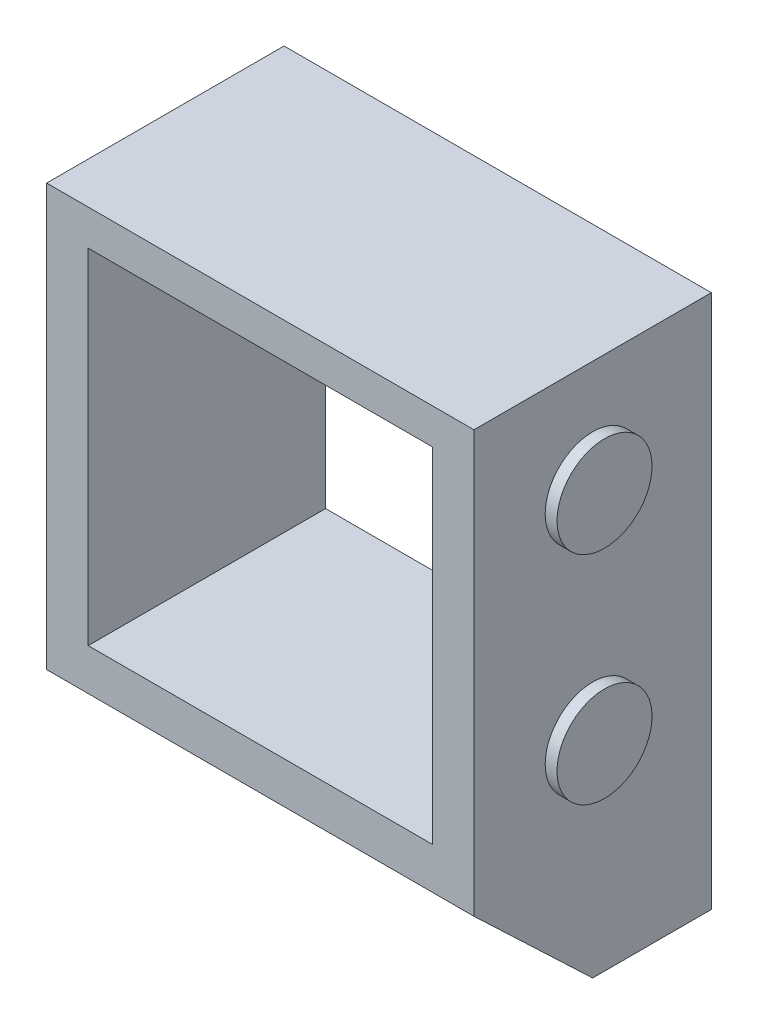
ISO-10303-21;
HEADER;
FILE_DESCRIPTION(('STEP AP214'),'2;1');
FILE_NAME('part.step','',(''),(''),'','','');
FILE_SCHEMA(('AUTOMOTIVE_DESIGN { 1 0 10303 214 1 1 1 1 }'));
ENDSEC;
DATA;
#1=APPLICATION_CONTEXT('core data for automotive mechanical design processes');
#2=APPLICATION_PROTOCOL_DEFINITION('international standard','automotive_design',2000,#1);
#3=PRODUCT_CONTEXT('',#1,'mechanical');
#4=PRODUCT('Part','Part','',(#3));
#5=PRODUCT_RELATED_PRODUCT_CATEGORY('part','',(#4));
#6=PRODUCT_DEFINITION_FORMATION('','',#4);
#7=PRODUCT_DEFINITION_CONTEXT('part definition',#1,'design');
#8=PRODUCT_DEFINITION('design','',#6,#7);
#9=PRODUCT_DEFINITION_SHAPE('','',#8);
#10=(LENGTH_UNIT() NAMED_UNIT(*) SI_UNIT(.MILLI.,.METRE.));
#11=(NAMED_UNIT(*) PLANE_ANGLE_UNIT() SI_UNIT($,.RADIAN.));
#12=(NAMED_UNIT(*) SI_UNIT($,.STERADIAN.) SOLID_ANGLE_UNIT());
#13=UNCERTAINTY_MEASURE_WITH_UNIT(LENGTH_MEASURE(1.E-05),#10,'distance_accuracy_value','');
#14=(GEOMETRIC_REPRESENTATION_CONTEXT(3) GLOBAL_UNCERTAINTY_ASSIGNED_CONTEXT((#13)) GLOBAL_UNIT_ASSIGNED_CONTEXT((#10,
#11,#12)) REPRESENTATION_CONTEXT('',''));
#15=CARTESIAN_POINT('',(0.,0.,0.));
#16=DIRECTION('',(0.,0.,1.));
#17=DIRECTION('',(1.,0.,0.));
#18=AXIS2_PLACEMENT_3D('',#15,#16,#17);
#19=CARTESIAN_POINT('',(0.,1143.,508.));
#20=DIRECTION('',(0.,1.,0.));
#21=DIRECTION('',(0.,0.,1.));
#22=AXIS2_PLACEMENT_3D('',#19,#20,#21);
#23=PLANE('',#22);
#24=DIRECTION('',(1.,0.,0.));
#25=VECTOR('',#24,1.);
#26=CARTESIAN_POINT('',(0.,1143.,0.));
#27=LINE('',#26,#25);
#28=CARTESIAN_POINT('',(0.,1143.,0.));
#29=VERTEX_POINT('',#28);
#30=CARTESIAN_POINT('',(914.4,1143.,0.));
#31=VERTEX_POINT('',#30);
#32=EDGE_CURVE('E168',#29,#31,#27,.T.);
#33=ORIENTED_EDGE('',*,*,#32,.F.);
#34=DIRECTION('',(0.,0.,-1.));
#35=VECTOR('',#34,1.);
#36=CARTESIAN_POINT('',(0.,1143.,508.));
#37=LINE('',#36,#35);
#38=CARTESIAN_POINT('',(0.,1143.,508.));
#39=VERTEX_POINT('',#38);
#40=EDGE_CURVE('E158',#39,#29,#37,.T.);
#41=ORIENTED_EDGE('',*,*,#40,.F.);
#42=DIRECTION('',(1.,0.,0.));
#43=VECTOR('',#42,1.);
#44=CARTESIAN_POINT('',(0.,1143.,508.));
#45=LINE('',#44,#43);
#46=CARTESIAN_POINT('',(914.4,1143.,508.));
#47=VERTEX_POINT('',#46);
#48=EDGE_CURVE('E170',#39,#47,#45,.T.);
#49=ORIENTED_EDGE('',*,*,#48,.T.);
#50=DIRECTION('',(0.,0.,-1.));
#51=VECTOR('',#50,1.);
#52=CARTESIAN_POINT('',(914.4,1143.,508.));
#53=LINE('',#52,#51);
#54=EDGE_CURVE('E178',#47,#31,#53,.T.);
#55=ORIENTED_EDGE('',*,*,#54,.T.);
#56=EDGE_LOOP('',(#33,#41,#49,#55));
#57=FACE_BOUND('',#56,.T.);
#58=ADVANCED_FACE('F35',(#57),#23,.T.);
#59=CARTESIAN_POINT('',(0.,0.,508.));
#60=DIRECTION('',(-1.,0.,0.));
#61=DIRECTION('',(0.,0.,1.));
#62=AXIS2_PLACEMENT_3D('',#59,#60,#61);
#63=PLANE('',#62);
#64=CARTESIAN_POINT('',(0.,446.916916508761,254.));
#65=DIRECTION('',(-1.,0.,0.));
#66=DIRECTION('',(0.,0.,1.));
#67=AXIS2_PLACEMENT_3D('',#64,#65,#66);
#68=CIRCLE('',#67,101.6);
#69=CARTESIAN_POINT('',(0.,446.916916508761,355.6));
#70=VERTEX_POINT('',#69);
#71=EDGE_CURVE('E11',#70,#70,#68,.T.);
#72=ORIENTED_EDGE('',*,*,#71,.F.);
#73=EDGE_LOOP('',(#72));
#74=FACE_BOUND('',#73,.T.);
#75=CARTESIAN_POINT('',(0.,910.66992522614,254.));
#76=DIRECTION('',(-1.,0.,0.));
#77=DIRECTION('',(0.,0.,1.));
#78=AXIS2_PLACEMENT_3D('',#75,#76,#77);
#79=CIRCLE('',#78,101.6);
#80=CARTESIAN_POINT('',(0.,910.66992522614,355.6));
#81=VERTEX_POINT('',#80);
#82=EDGE_CURVE('E43',#81,#81,#79,.T.);
#83=ORIENTED_EDGE('',*,*,#82,.F.);
#84=EDGE_LOOP('',(#83));
#85=FACE_BOUND('',#84,.T.);
#86=DIRECTION('',(0.,0.688749461914693,0.724999433594414));
#87=VECTOR('',#86,1.);
#88=CARTESIAN_POINT('',(0.,241.3,508.));
#89=LINE('',#88,#87);
#90=CARTESIAN_POINT('',(0.,0.,254.));
#91=VERTEX_POINT('',#90);
#92=CARTESIAN_POINT('',(0.,241.3,508.));
#93=VERTEX_POINT('',#92);
#94=EDGE_CURVE('E159',#91,#93,#89,.T.);
#95=ORIENTED_EDGE('',*,*,#94,.T.);
#96=DIRECTION('',(0.,1.,0.));
#97=VECTOR('',#96,1.);
#98=CARTESIAN_POINT('',(0.,0.,508.));
#99=LINE('',#98,#97);
#100=EDGE_CURVE('E176',#93,#39,#99,.T.);
#101=ORIENTED_EDGE('',*,*,#100,.T.);
#102=ORIENTED_EDGE('',*,*,#40,.T.);
#103=DIRECTION('',(0.,1.,0.));
#104=VECTOR('',#103,1.);
#105=CARTESIAN_POINT('',(0.,0.,0.));
#106=LINE('',#105,#104);
#107=CARTESIAN_POINT('',(0.,0.,0.));
#108=VERTEX_POINT('',#107);
#109=EDGE_CURVE('E174',#108,#29,#106,.T.);
#110=ORIENTED_EDGE('',*,*,#109,.F.);
#111=DIRECTION('',(0.,0.,-1.));
#112=VECTOR('',#111,1.);
#113=CARTESIAN_POINT('',(0.,0.,508.));
#114=LINE('',#113,#112);
#115=EDGE_CURVE('E190',#91,#108,#114,.T.);
#116=ORIENTED_EDGE('',*,*,#115,.F.);
#117=EDGE_LOOP('',(#95,#101,#102,#110,#116));
#118=FACE_BOUND('',#117,.T.);
#119=ADVANCED_FACE('F219',(#74,#85,#118),#63,.T.);
#120=CARTESIAN_POINT('',(0.,0.,508.));
#121=DIRECTION('',(0.,1.,0.));
#122=DIRECTION('',(0.,0.,1.));
#123=AXIS2_PLACEMENT_3D('',#120,#121,#122);
#124=PLANE('',#123);
#125=DIRECTION('',(0.,0.,-1.));
#126=VECTOR('',#125,1.);
#127=CARTESIAN_POINT('',(914.4,0.,508.));
#128=LINE('',#127,#126);
#129=CARTESIAN_POINT('',(914.4,0.,254.));
#130=VERTEX_POINT('',#129);
#131=CARTESIAN_POINT('',(914.4,0.,0.));
#132=VERTEX_POINT('',#131);
#133=EDGE_CURVE('E192',#130,#132,#128,.T.);
#134=ORIENTED_EDGE('',*,*,#133,.F.);
#135=DIRECTION('',(1.,0.,0.));
#136=VECTOR('',#135,1.);
#137=CARTESIAN_POINT('',(0.,0.,254.));
#138=LINE('',#137,#136);
#139=EDGE_CURVE('E162',#91,#130,#138,.T.);
#140=ORIENTED_EDGE('',*,*,#139,.F.);
#141=ORIENTED_EDGE('',*,*,#115,.T.);
#142=DIRECTION('',(1.,0.,0.));
#143=VECTOR('',#142,1.);
#144=CARTESIAN_POINT('',(0.,0.,0.));
#145=LINE('',#144,#143);
#146=EDGE_CURVE('E184',#108,#132,#145,.T.);
#147=ORIENTED_EDGE('',*,*,#146,.T.);
#148=EDGE_LOOP('',(#134,#140,#141,#147));
#149=FACE_BOUND('',#148,.T.);
#150=ADVANCED_FACE('F224',(#149),#124,.F.);
#151=CARTESIAN_POINT('',(914.4,0.,508.));
#152=DIRECTION('',(-1.,0.,0.));
#153=DIRECTION('',(0.,0.,1.));
#154=AXIS2_PLACEMENT_3D('',#151,#152,#153);
#155=PLANE('',#154);
#156=CARTESIAN_POINT('',(914.4,446.916916508761,254.));
#157=DIRECTION('',(-1.,0.,0.));
#158=DIRECTION('',(0.,0.,1.));
#159=AXIS2_PLACEMENT_3D('',#156,#157,#158);
#160=CIRCLE('',#159,101.6);
#161=CARTESIAN_POINT('',(914.4,446.916916508761,355.6));
#162=VERTEX_POINT('',#161);
#163=EDGE_CURVE('E38',#162,#162,#160,.T.);
#164=ORIENTED_EDGE('',*,*,#163,.T.);
#165=EDGE_LOOP('',(#164));
#166=FACE_BOUND('',#165,.T.);
#167=CARTESIAN_POINT('',(914.4,910.66992522614,254.));
#168=DIRECTION('',(-1.,0.,0.));
#169=DIRECTION('',(0.,0.,1.));
#170=AXIS2_PLACEMENT_3D('',#167,#168,#169);
#171=CIRCLE('',#170,101.6);
#172=CARTESIAN_POINT('',(914.4,910.66992522614,355.6));
#173=VERTEX_POINT('',#172);
#174=EDGE_CURVE('E155',#173,#173,#171,.T.);
#175=ORIENTED_EDGE('',*,*,#174,.T.);
#176=EDGE_LOOP('',(#175));
#177=FACE_BOUND('',#176,.T.);
#178=DIRECTION('',(0.,1.,0.));
#179=VECTOR('',#178,1.);
#180=CARTESIAN_POINT('',(914.4,0.,508.));
#181=LINE('',#180,#179);
#182=CARTESIAN_POINT('',(914.4,241.3,508.));
#183=VERTEX_POINT('',#182);
#184=EDGE_CURVE('E173',#183,#47,#181,.T.);
#185=ORIENTED_EDGE('',*,*,#184,.F.);
#186=DIRECTION('',(0.,0.688749461914693,0.724999433594414));
#187=VECTOR('',#186,1.);
#188=CARTESIAN_POINT('',(914.4,241.3,508.));
#189=LINE('',#188,#187);
#190=EDGE_CURVE('E163',#130,#183,#189,.T.);
#191=ORIENTED_EDGE('',*,*,#190,.F.);
#192=ORIENTED_EDGE('',*,*,#133,.T.);
#193=DIRECTION('',(0.,1.,0.));
#194=VECTOR('',#193,1.);
#195=CARTESIAN_POINT('',(914.4,0.,0.));
#196=LINE('',#195,#194);
#197=EDGE_CURVE('E181',#132,#31,#196,.T.);
#198=ORIENTED_EDGE('',*,*,#197,.T.);
#199=ORIENTED_EDGE('',*,*,#54,.F.);
#200=EDGE_LOOP('',(#185,#191,#192,#198,#199));
#201=FACE_BOUND('',#200,.T.);
#202=ADVANCED_FACE('F197',(#166,#177,#201),#155,.F.);
#203=CARTESIAN_POINT('',(0.,0.,508.));
#204=DIRECTION('',(0.,0.,1.));
#205=DIRECTION('',(1.,0.,0.));
#206=AXIS2_PLACEMENT_3D('',#203,#204,#205);
#207=PLANE('',#206);
#208=DIRECTION('',(0.,-1.,0.));
#209=VECTOR('',#208,1.);
#210=CARTESIAN_POINT('',(88.9,1066.8,508.));
#211=LINE('',#210,#209);
#212=CARTESIAN_POINT('',(88.9,1066.8,508.));
#213=VERTEX_POINT('',#212);
#214=CARTESIAN_POINT('',(88.9000000000001,330.2,508.));
#215=VERTEX_POINT('',#214);
#216=EDGE_CURVE('E51',#213,#215,#211,.T.);
#217=ORIENTED_EDGE('',*,*,#216,.F.);
#218=DIRECTION('',(-1.,0.,0.));
#219=VECTOR('',#218,1.);
#220=CARTESIAN_POINT('',(88.9,1066.8,508.));
#221=LINE('',#220,#219);
#222=CARTESIAN_POINT('',(825.5,1066.8,508.));
#223=VERTEX_POINT('',#222);
#224=EDGE_CURVE('E115',#223,#213,#221,.T.);
#225=ORIENTED_EDGE('',*,*,#224,.F.);
#226=DIRECTION('',(0.,1.,0.));
#227=VECTOR('',#226,1.);
#228=CARTESIAN_POINT('',(825.5,1066.8,508.));
#229=LINE('',#228,#227);
#230=CARTESIAN_POINT('',(825.5,330.2,508.));
#231=VERTEX_POINT('',#230);
#232=EDGE_CURVE('E135',#231,#223,#229,.T.);
#233=ORIENTED_EDGE('',*,*,#232,.F.);
#234=DIRECTION('',(1.,0.,0.));
#235=VECTOR('',#234,1.);
#236=CARTESIAN_POINT('',(88.9000000000001,330.2,508.));
#237=LINE('',#236,#235);
#238=EDGE_CURVE('E129',#215,#231,#237,.T.);
#239=ORIENTED_EDGE('',*,*,#238,.F.);
#240=EDGE_LOOP('',(#217,#225,#233,#239));
#241=FACE_BOUND('',#240,.T.);
#242=DIRECTION('',(1.,0.,0.));
#243=VECTOR('',#242,1.);
#244=CARTESIAN_POINT('',(0.,241.3,508.));
#245=LINE('',#244,#243);
#246=EDGE_CURVE('E165',#93,#183,#245,.T.);
#247=ORIENTED_EDGE('',*,*,#246,.T.);
#248=ORIENTED_EDGE('',*,*,#184,.T.);
#249=ORIENTED_EDGE('',*,*,#48,.F.);
#250=ORIENTED_EDGE('',*,*,#100,.F.);
#251=EDGE_LOOP('',(#247,#248,#249,#250));
#252=FACE_BOUND('',#251,.T.);
#253=ADVANCED_FACE('F238',(#241,#252),#207,.T.);
#254=CARTESIAN_POINT('',(0.,0.,0.));
#255=DIRECTION('',(0.,0.,1.));
#256=DIRECTION('',(1.,0.,0.));
#257=AXIS2_PLACEMENT_3D('',#254,#255,#256);
#258=PLANE('',#257);
#259=DIRECTION('',(1.,0.,0.));
#260=VECTOR('',#259,1.);
#261=CARTESIAN_POINT('',(88.9,1066.8,0.));
#262=LINE('',#261,#260);
#263=CARTESIAN_POINT('',(88.9,1066.8,0.));
#264=VERTEX_POINT('',#263);
#265=CARTESIAN_POINT('',(825.5,1066.8,0.));
#266=VERTEX_POINT('',#265);
#267=EDGE_CURVE('E127',#264,#266,#262,.T.);
#268=ORIENTED_EDGE('',*,*,#267,.F.);
#269=DIRECTION('',(0.,1.,0.));
#270=VECTOR('',#269,1.);
#271=CARTESIAN_POINT('',(88.9,1066.8,0.));
#272=LINE('',#271,#270);
#273=CARTESIAN_POINT('',(88.9000000000001,330.2,0.));
#274=VERTEX_POINT('',#273);
#275=EDGE_CURVE('E109',#274,#264,#272,.T.);
#276=ORIENTED_EDGE('',*,*,#275,.F.);
#277=DIRECTION('',(-1.,0.,0.));
#278=VECTOR('',#277,1.);
#279=CARTESIAN_POINT('',(88.9000000000001,330.2,0.));
#280=LINE('',#279,#278);
#281=CARTESIAN_POINT('',(825.5,330.2,0.));
#282=VERTEX_POINT('',#281);
#283=EDGE_CURVE('E118',#282,#274,#280,.T.);
#284=ORIENTED_EDGE('',*,*,#283,.F.);
#285=DIRECTION('',(0.,-1.,0.));
#286=VECTOR('',#285,1.);
#287=CARTESIAN_POINT('',(825.5,1066.8,0.));
#288=LINE('',#287,#286);
#289=EDGE_CURVE('E59',#266,#282,#288,.T.);
#290=ORIENTED_EDGE('',*,*,#289,.F.);
#291=EDGE_LOOP('',(#268,#276,#284,#290));
#292=FACE_BOUND('',#291,.T.);
#293=ORIENTED_EDGE('',*,*,#32,.T.);
#294=ORIENTED_EDGE('',*,*,#197,.F.);
#295=ORIENTED_EDGE('',*,*,#146,.F.);
#296=ORIENTED_EDGE('',*,*,#109,.T.);
#297=EDGE_LOOP('',(#293,#294,#295,#296));
#298=FACE_BOUND('',#297,.T.);
#299=ADVANCED_FACE('F124',(#292,#298),#258,.F.);
#300=CARTESIAN_POINT('',(0.,241.3,508.));
#301=DIRECTION('',(0.,0.724999433594414,-0.688749461914693));
#302=DIRECTION('',(0.,0.688749461914693,0.724999433594414));
#303=AXIS2_PLACEMENT_3D('',#300,#301,#302);
#304=PLANE('',#303);
#305=ORIENTED_EDGE('',*,*,#190,.T.);
#306=ORIENTED_EDGE('',*,*,#246,.F.);
#307=ORIENTED_EDGE('',*,*,#94,.F.);
#308=ORIENTED_EDGE('',*,*,#139,.T.);
#309=EDGE_LOOP('',(#305,#306,#307,#308));
#310=FACE_BOUND('',#309,.T.);
#311=ADVANCED_FACE('F212',(#310),#304,.F.);
#312=CARTESIAN_POINT('',(939.8,910.66992522614,254.));
#313=DIRECTION('',(1.,0.,0.));
#314=DIRECTION('',(0.,0.,-1.));
#315=AXIS2_PLACEMENT_3D('',#312,#313,#314);
#316=PLANE('',#315);
#317=CARTESIAN_POINT('',(939.8,910.66992522614,254.));
#318=DIRECTION('',(1.,0.,0.));
#319=DIRECTION('',(0.,0.,-1.));
#320=AXIS2_PLACEMENT_3D('',#317,#318,#319);
#321=CIRCLE('',#320,101.6);
#322=CARTESIAN_POINT('',(939.8,910.66992522614,152.4));
#323=VERTEX_POINT('',#322);
#324=EDGE_CURVE('E149',#323,#323,#321,.T.);
#325=ORIENTED_EDGE('',*,*,#324,.T.);
#326=EDGE_LOOP('',(#325));
#327=FACE_BOUND('',#326,.T.);
#328=ADVANCED_FACE('F203',(#327),#316,.T.);
#329=CARTESIAN_POINT('',(-25.4,910.66992522614,254.));
#330=DIRECTION('',(1.,0.,0.));
#331=DIRECTION('',(0.,0.,-1.));
#332=AXIS2_PLACEMENT_3D('',#329,#330,#331);
#333=CYLINDRICAL_SURFACE('',#332,101.6);
#334=ORIENTED_EDGE('',*,*,#324,.F.);
#335=EDGE_LOOP('',(#334));
#336=FACE_BOUND('',#335,.T.);
#337=ORIENTED_EDGE('',*,*,#174,.F.);
#338=EDGE_LOOP('',(#337));
#339=FACE_BOUND('',#338,.T.);
#340=ADVANCED_FACE('F200',(#336,#339),#333,.T.);
#341=ORIENTED_EDGE('',*,*,#82,.T.);
#342=EDGE_LOOP('',(#341));
#343=FACE_BOUND('',#342,.T.);
#344=CARTESIAN_POINT('',(-25.4,910.66992522614,254.));
#345=DIRECTION('',(1.,0.,0.));
#346=DIRECTION('',(0.,0.,-1.));
#347=AXIS2_PLACEMENT_3D('',#344,#345,#346);
#348=CIRCLE('',#347,101.6);
#349=CARTESIAN_POINT('',(-25.4,910.66992522614,152.4));
#350=VERTEX_POINT('',#349);
#351=EDGE_CURVE('E152',#350,#350,#348,.T.);
#352=ORIENTED_EDGE('',*,*,#351,.T.);
#353=EDGE_LOOP('',(#352));
#354=FACE_BOUND('',#353,.T.);
#355=ADVANCED_FACE('F202',(#343,#354),#333,.T.);
#356=CARTESIAN_POINT('',(-25.4,910.66992522614,254.));
#357=DIRECTION('',(1.,0.,0.));
#358=DIRECTION('',(0.,0.,-1.));
#359=AXIS2_PLACEMENT_3D('',#356,#357,#358);
#360=PLANE('',#359);
#361=ORIENTED_EDGE('',*,*,#351,.F.);
#362=EDGE_LOOP('',(#361));
#363=FACE_BOUND('',#362,.T.);
#364=ADVANCED_FACE('F210',(#363),#360,.F.);
#365=CARTESIAN_POINT('',(939.8,446.916916508761,254.));
#366=DIRECTION('',(1.,0.,0.));
#367=DIRECTION('',(0.,0.,-1.));
#368=AXIS2_PLACEMENT_3D('',#365,#366,#367);
#369=PLANE('',#368);
#370=CARTESIAN_POINT('',(939.8,446.916916508761,254.));
#371=DIRECTION('',(1.,0.,0.));
#372=DIRECTION('',(0.,0.,-1.));
#373=AXIS2_PLACEMENT_3D('',#370,#371,#372);
#374=CIRCLE('',#373,101.6);
#375=CARTESIAN_POINT('',(939.8,446.916916508761,152.4));
#376=VERTEX_POINT('',#375);
#377=EDGE_CURVE('E121',#376,#376,#374,.T.);
#378=ORIENTED_EDGE('',*,*,#377,.T.);
#379=EDGE_LOOP('',(#378));
#380=FACE_BOUND('',#379,.T.);
#381=ADVANCED_FACE('F265',(#380),#369,.T.);
#382=CARTESIAN_POINT('',(-25.4,446.916916508761,254.));
#383=DIRECTION('',(1.,0.,0.));
#384=DIRECTION('',(0.,0.,-1.));
#385=AXIS2_PLACEMENT_3D('',#382,#383,#384);
#386=CYLINDRICAL_SURFACE('',#385,101.6);
#387=ORIENTED_EDGE('',*,*,#377,.F.);
#388=EDGE_LOOP('',(#387));
#389=FACE_BOUND('',#388,.T.);
#390=ORIENTED_EDGE('',*,*,#163,.F.);
#391=EDGE_LOOP('',(#390));
#392=FACE_BOUND('',#391,.T.);
#393=ADVANCED_FACE('F262',(#389,#392),#386,.T.);
#394=ORIENTED_EDGE('',*,*,#71,.T.);
#395=EDGE_LOOP('',(#394));
#396=FACE_BOUND('',#395,.T.);
#397=CARTESIAN_POINT('',(-25.4,446.916916508761,254.));
#398=DIRECTION('',(1.,0.,0.));
#399=DIRECTION('',(0.,0.,-1.));
#400=AXIS2_PLACEMENT_3D('',#397,#398,#399);
#401=CIRCLE('',#400,101.6);
#402=CARTESIAN_POINT('',(-25.4,446.916916508761,152.4));
#403=VERTEX_POINT('',#402);
#404=EDGE_CURVE('E146',#403,#403,#401,.T.);
#405=ORIENTED_EDGE('',*,*,#404,.T.);
#406=EDGE_LOOP('',(#405));
#407=FACE_BOUND('',#406,.T.);
#408=ADVANCED_FACE('F264',(#396,#407),#386,.T.);
#409=CARTESIAN_POINT('',(-25.4,446.916916508761,254.));
#410=DIRECTION('',(1.,0.,0.));
#411=DIRECTION('',(0.,0.,-1.));
#412=AXIS2_PLACEMENT_3D('',#409,#410,#411);
#413=PLANE('',#412);
#414=ORIENTED_EDGE('',*,*,#404,.F.);
#415=EDGE_LOOP('',(#414));
#416=FACE_BOUND('',#415,.T.);
#417=ADVANCED_FACE('F272',(#416),#413,.F.);
#418=CARTESIAN_POINT('',(88.9,1066.8,-0.00100000000002876));
#419=DIRECTION('',(-1.,0.,0.));
#420=DIRECTION('',(0.,-1.,0.));
#421=AXIS2_PLACEMENT_3D('',#418,#419,#420);
#422=PLANE('',#421);
#423=ORIENTED_EDGE('',*,*,#275,.T.);
#424=DIRECTION('',(0.,0.,1.));
#425=VECTOR('',#424,1.);
#426=CARTESIAN_POINT('',(88.9,1066.8,-0.00100000000002876));
#427=LINE('',#426,#425);
#428=EDGE_CURVE('E122',#264,#213,#427,.T.);
#429=ORIENTED_EDGE('',*,*,#428,.T.);
#430=ORIENTED_EDGE('',*,*,#216,.T.);
#431=DIRECTION('',(0.,0.,1.));
#432=VECTOR('',#431,1.);
#433=CARTESIAN_POINT('',(88.9000000000001,330.2,-0.00100000000002876));
#434=LINE('',#433,#432);
#435=EDGE_CURVE('E105',#274,#215,#434,.T.);
#436=ORIENTED_EDGE('',*,*,#435,.F.);
#437=EDGE_LOOP('',(#423,#429,#430,#436));
#438=FACE_BOUND('',#437,.T.);
#439=ADVANCED_FACE('F107',(#438),#422,.F.);
#440=CARTESIAN_POINT('',(88.9,1066.8,-0.00100000000002876));
#441=DIRECTION('',(0.,1.,0.));
#442=DIRECTION('',(0.,0.,1.));
#443=AXIS2_PLACEMENT_3D('',#440,#441,#442);
#444=PLANE('',#443);
#445=ORIENTED_EDGE('',*,*,#267,.T.);
#446=DIRECTION('',(0.,0.,1.));
#447=VECTOR('',#446,1.);
#448=CARTESIAN_POINT('',(825.5,1066.8,-0.00100000000002876));
#449=LINE('',#448,#447);
#450=EDGE_CURVE('E141',#266,#223,#449,.T.);
#451=ORIENTED_EDGE('',*,*,#450,.T.);
#452=ORIENTED_EDGE('',*,*,#224,.T.);
#453=ORIENTED_EDGE('',*,*,#428,.F.);
#454=EDGE_LOOP('',(#445,#451,#452,#453));
#455=FACE_BOUND('',#454,.T.);
#456=ADVANCED_FACE('F331',(#455),#444,.F.);
#457=CARTESIAN_POINT('',(825.5,1066.8,-0.00100000000002876));
#458=DIRECTION('',(1.,0.,0.));
#459=DIRECTION('',(0.,1.,0.));
#460=AXIS2_PLACEMENT_3D('',#457,#458,#459);
#461=PLANE('',#460);
#462=ORIENTED_EDGE('',*,*,#289,.T.);
#463=DIRECTION('',(0.,0.,1.));
#464=VECTOR('',#463,1.);
#465=CARTESIAN_POINT('',(825.5,330.2,-0.00100000000002876));
#466=LINE('',#465,#464);
#467=EDGE_CURVE('E114',#282,#231,#466,.T.);
#468=ORIENTED_EDGE('',*,*,#467,.T.);
#469=ORIENTED_EDGE('',*,*,#232,.T.);
#470=ORIENTED_EDGE('',*,*,#450,.F.);
#471=EDGE_LOOP('',(#462,#468,#469,#470));
#472=FACE_BOUND('',#471,.T.);
#473=ADVANCED_FACE('F340',(#472),#461,.F.);
#474=CARTESIAN_POINT('',(88.9000000000001,330.2,-0.00100000000002876));
#475=DIRECTION('',(0.,-1.,0.));
#476=DIRECTION('',(0.,0.,-1.));
#477=AXIS2_PLACEMENT_3D('',#474,#475,#476);
#478=PLANE('',#477);
#479=ORIENTED_EDGE('',*,*,#283,.T.);
#480=ORIENTED_EDGE('',*,*,#435,.T.);
#481=ORIENTED_EDGE('',*,*,#238,.T.);
#482=ORIENTED_EDGE('',*,*,#467,.F.);
#483=EDGE_LOOP('',(#479,#480,#481,#482));
#484=FACE_BOUND('',#483,.T.);
#485=ADVANCED_FACE('F119',(#484),#478,.F.);
#486=CLOSED_SHELL('',(#58,#119,#150,#202,#253,#299,#311,#328,#340,#355,#364,#381,#393,#408,#417,
#439,#456,#473,#485));
#487=MANIFOLD_SOLID_BREP('B2',#486);
#488=ADVANCED_BREP_SHAPE_REPRESENTATION('',(#18,#487),#14);
#489=SHAPE_DEFINITION_REPRESENTATION(#9,#488);
ENDSEC;
END-ISO-10303-21;
